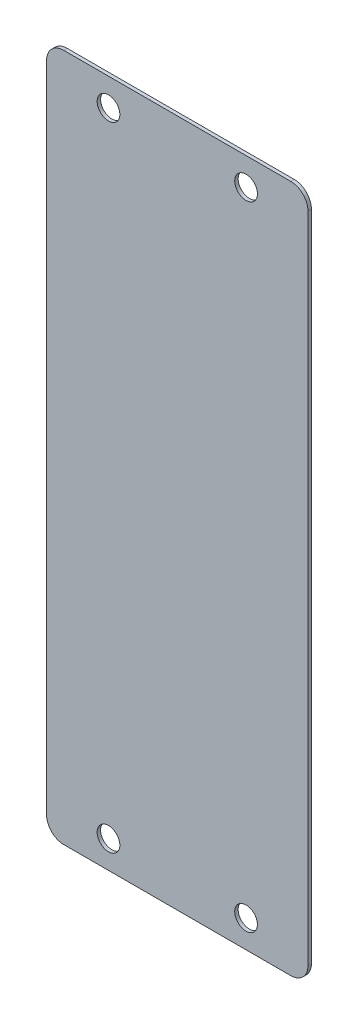
ISO-10303-21;
HEADER;
FILE_DESCRIPTION(('STEP AP214'),'2;1');
FILE_NAME('part.step','',(''),(''),'','','');
FILE_SCHEMA(('AUTOMOTIVE_DESIGN { 1 0 10303 214 1 1 1 1 }'));
ENDSEC;
DATA;
#1=APPLICATION_CONTEXT('core data for automotive mechanical design processes');
#2=APPLICATION_PROTOCOL_DEFINITION('international standard','automotive_design',2000,#1);
#3=PRODUCT_CONTEXT('',#1,'mechanical');
#4=PRODUCT('Part','Part','',(#3));
#5=PRODUCT_RELATED_PRODUCT_CATEGORY('part','',(#4));
#6=PRODUCT_DEFINITION_FORMATION('','',#4);
#7=PRODUCT_DEFINITION_CONTEXT('part definition',#1,'design');
#8=PRODUCT_DEFINITION('design','',#6,#7);
#9=PRODUCT_DEFINITION_SHAPE('','',#8);
#10=(LENGTH_UNIT() NAMED_UNIT(*) SI_UNIT(.MILLI.,.METRE.));
#11=(NAMED_UNIT(*) PLANE_ANGLE_UNIT() SI_UNIT($,.RADIAN.));
#12=(NAMED_UNIT(*) SI_UNIT($,.STERADIAN.) SOLID_ANGLE_UNIT());
#13=UNCERTAINTY_MEASURE_WITH_UNIT(LENGTH_MEASURE(1.E-05),#10,'distance_accuracy_value','');
#14=(GEOMETRIC_REPRESENTATION_CONTEXT(3) GLOBAL_UNCERTAINTY_ASSIGNED_CONTEXT((#13)) GLOBAL_UNIT_ASSIGNED_CONTEXT((#10,
#11,#12)) REPRESENTATION_CONTEXT('',''));
#15=CARTESIAN_POINT('',(0.,0.,0.));
#16=DIRECTION('',(0.,0.,1.));
#17=DIRECTION('',(1.,0.,0.));
#18=AXIS2_PLACEMENT_3D('',#15,#16,#17);
#19=CARTESIAN_POINT('',(38.,100.,1.));
#20=DIRECTION('',(-1.,0.,0.));
#21=DIRECTION('',(0.,-1.,0.));
#22=AXIS2_PLACEMENT_3D('',#19,#20,#21);
#23=PLANE('',#22);
#24=DIRECTION('',(0.,1.,0.));
#25=VECTOR('',#24,1.);
#26=CARTESIAN_POINT('',(38.,100.,1.));
#27=LINE('',#26,#25);
#28=CARTESIAN_POINT('',(38.,-95.,1.));
#29=VERTEX_POINT('',#28);
#30=CARTESIAN_POINT('',(38.,95.,1.));
#31=VERTEX_POINT('',#30);
#32=EDGE_CURVE('E133',#29,#31,#27,.T.);
#33=ORIENTED_EDGE('',*,*,#32,.F.);
#34=DIRECTION('',(0.,0.,-1.));
#35=VECTOR('',#34,1.);
#36=CARTESIAN_POINT('',(38.,-95.,1.));
#37=LINE('',#36,#35);
#38=CARTESIAN_POINT('',(38.,-95.,0.));
#39=VERTEX_POINT('',#38);
#40=EDGE_CURVE('E173',#29,#39,#37,.T.);
#41=ORIENTED_EDGE('',*,*,#40,.T.);
#42=DIRECTION('',(0.,1.,0.));
#43=VECTOR('',#42,1.);
#44=CARTESIAN_POINT('',(38.,100.,0.));
#45=LINE('',#44,#43);
#46=CARTESIAN_POINT('',(38.,95.,0.));
#47=VERTEX_POINT('',#46);
#48=EDGE_CURVE('E185',#39,#47,#45,.T.);
#49=ORIENTED_EDGE('',*,*,#48,.T.);
#50=DIRECTION('',(0.,0.,-1.));
#51=VECTOR('',#50,1.);
#52=CARTESIAN_POINT('',(38.,95.,1.));
#53=LINE('',#52,#51);
#54=EDGE_CURVE('E170',#47,#31,#53,.F.);
#55=ORIENTED_EDGE('',*,*,#54,.T.);
#56=EDGE_LOOP('',(#33,#41,#49,#55));
#57=FACE_BOUND('',#56,.T.);
#58=ADVANCED_FACE('F38',(#57),#23,.F.);
#59=CARTESIAN_POINT('',(-38.,100.,1.));
#60=DIRECTION('',(0.,-1.,0.));
#61=DIRECTION('',(0.,0.,-1.));
#62=AXIS2_PLACEMENT_3D('',#59,#60,#61);
#63=PLANE('',#62);
#64=DIRECTION('',(-1.,0.,0.));
#65=VECTOR('',#64,1.);
#66=CARTESIAN_POINT('',(-38.,100.,0.));
#67=LINE('',#66,#65);
#68=CARTESIAN_POINT('',(33.,100.,0.));
#69=VERTEX_POINT('',#68);
#70=CARTESIAN_POINT('',(-33.,100.,0.));
#71=VERTEX_POINT('',#70);
#72=EDGE_CURVE('E141',#69,#71,#67,.T.);
#73=ORIENTED_EDGE('',*,*,#72,.T.);
#74=DIRECTION('',(0.,0.,-1.));
#75=VECTOR('',#74,1.);
#76=CARTESIAN_POINT('',(-33.,100.,1.));
#77=LINE('',#76,#75);
#78=CARTESIAN_POINT('',(-33.,100.,1.));
#79=VERTEX_POINT('',#78);
#80=EDGE_CURVE('E11',#71,#79,#77,.F.);
#81=ORIENTED_EDGE('',*,*,#80,.T.);
#82=DIRECTION('',(-1.,0.,0.));
#83=VECTOR('',#82,1.);
#84=CARTESIAN_POINT('',(-38.,100.,1.));
#85=LINE('',#84,#83);
#86=CARTESIAN_POINT('',(33.,100.,1.));
#87=VERTEX_POINT('',#86);
#88=EDGE_CURVE('E139',#87,#79,#85,.T.);
#89=ORIENTED_EDGE('',*,*,#88,.F.);
#90=DIRECTION('',(0.,0.,-1.));
#91=VECTOR('',#90,1.);
#92=CARTESIAN_POINT('',(33.,100.,1.));
#93=LINE('',#92,#91);
#94=EDGE_CURVE('E47',#87,#69,#93,.T.);
#95=ORIENTED_EDGE('',*,*,#94,.T.);
#96=EDGE_LOOP('',(#73,#81,#89,#95));
#97=FACE_BOUND('',#96,.T.);
#98=ADVANCED_FACE('F181',(#97),#63,.F.);
#99=CARTESIAN_POINT('',(-38.,100.,1.));
#100=DIRECTION('',(1.,0.,0.));
#101=DIRECTION('',(0.,1.,0.));
#102=AXIS2_PLACEMENT_3D('',#99,#100,#101);
#103=PLANE('',#102);
#104=DIRECTION('',(0.,-1.,0.));
#105=VECTOR('',#104,1.);
#106=CARTESIAN_POINT('',(-38.,100.,0.));
#107=LINE('',#106,#105);
#108=CARTESIAN_POINT('',(-38.,95.,0.));
#109=VERTEX_POINT('',#108);
#110=CARTESIAN_POINT('',(-38.,-95.,0.));
#111=VERTEX_POINT('',#110);
#112=EDGE_CURVE('E134',#109,#111,#107,.T.);
#113=ORIENTED_EDGE('',*,*,#112,.T.);
#114=DIRECTION('',(0.,0.,-1.));
#115=VECTOR('',#114,1.);
#116=CARTESIAN_POINT('',(-38.,-95.,1.));
#117=LINE('',#116,#115);
#118=CARTESIAN_POINT('',(-38.,-95.,1.));
#119=VERTEX_POINT('',#118);
#120=EDGE_CURVE('E109',#111,#119,#117,.F.);
#121=ORIENTED_EDGE('',*,*,#120,.T.);
#122=DIRECTION('',(0.,-1.,0.));
#123=VECTOR('',#122,1.);
#124=CARTESIAN_POINT('',(-38.,100.,1.));
#125=LINE('',#124,#123);
#126=CARTESIAN_POINT('',(-38.,95.,1.));
#127=VERTEX_POINT('',#126);
#128=EDGE_CURVE('E193',#127,#119,#125,.T.);
#129=ORIENTED_EDGE('',*,*,#128,.F.);
#130=DIRECTION('',(0.,0.,-1.));
#131=VECTOR('',#130,1.);
#132=CARTESIAN_POINT('',(-38.,95.,1.));
#133=LINE('',#132,#131);
#134=EDGE_CURVE('E115',#127,#109,#133,.T.);
#135=ORIENTED_EDGE('',*,*,#134,.T.);
#136=EDGE_LOOP('',(#113,#121,#129,#135));
#137=FACE_BOUND('',#136,.T.);
#138=ADVANCED_FACE('F252',(#137),#103,.F.);
#139=CARTESIAN_POINT('',(-38.,-100.,1.));
#140=DIRECTION('',(0.,1.,0.));
#141=DIRECTION('',(0.,0.,1.));
#142=AXIS2_PLACEMENT_3D('',#139,#140,#141);
#143=PLANE('',#142);
#144=DIRECTION('',(1.,0.,0.));
#145=VECTOR('',#144,1.);
#146=CARTESIAN_POINT('',(-38.,-100.,1.));
#147=LINE('',#146,#145);
#148=CARTESIAN_POINT('',(-33.,-100.,1.));
#149=VERTEX_POINT('',#148);
#150=CARTESIAN_POINT('',(33.,-100.,1.));
#151=VERTEX_POINT('',#150);
#152=EDGE_CURVE('E125',#149,#151,#147,.T.);
#153=ORIENTED_EDGE('',*,*,#152,.F.);
#154=DIRECTION('',(0.,0.,-1.));
#155=VECTOR('',#154,1.);
#156=CARTESIAN_POINT('',(-33.,-100.,1.));
#157=LINE('',#156,#155);
#158=CARTESIAN_POINT('',(-33.,-100.,0.));
#159=VERTEX_POINT('',#158);
#160=EDGE_CURVE('E108',#149,#159,#157,.T.);
#161=ORIENTED_EDGE('',*,*,#160,.T.);
#162=DIRECTION('',(1.,0.,0.));
#163=VECTOR('',#162,1.);
#164=CARTESIAN_POINT('',(-38.,-100.,0.));
#165=LINE('',#164,#163);
#166=CARTESIAN_POINT('',(33.,-100.,0.));
#167=VERTEX_POINT('',#166);
#168=EDGE_CURVE('E122',#159,#167,#165,.T.);
#169=ORIENTED_EDGE('',*,*,#168,.T.);
#170=DIRECTION('',(0.,0.,-1.));
#171=VECTOR('',#170,1.);
#172=CARTESIAN_POINT('',(33.,-100.,1.));
#173=LINE('',#172,#171);
#174=EDGE_CURVE('E128',#167,#151,#173,.F.);
#175=ORIENTED_EDGE('',*,*,#174,.T.);
#176=EDGE_LOOP('',(#153,#161,#169,#175));
#177=FACE_BOUND('',#176,.T.);
#178=ADVANCED_FACE('F121',(#177),#143,.F.);
#179=CARTESIAN_POINT('',(0.,0.,1.));
#180=DIRECTION('',(0.,0.,1.));
#181=DIRECTION('',(1.,0.,0.));
#182=AXIS2_PLACEMENT_3D('',#179,#180,#181);
#183=PLANE('',#182);
#184=CARTESIAN_POINT('',(20.,92.,1.));
#185=DIRECTION('',(0.,0.,1.));
#186=DIRECTION('',(1.,0.,0.));
#187=AXIS2_PLACEMENT_3D('',#184,#185,#186);
#188=CIRCLE('',#187,3.3);
#189=CARTESIAN_POINT('',(23.3,92.,1.));
#190=VERTEX_POINT('',#189);
#191=EDGE_CURVE('E216',#190,#190,#188,.T.);
#192=ORIENTED_EDGE('',*,*,#191,.F.);
#193=EDGE_LOOP('',(#192));
#194=FACE_BOUND('',#193,.T.);
#195=CARTESIAN_POINT('',(-20.,-92.,1.));
#196=DIRECTION('',(0.,0.,1.));
#197=DIRECTION('',(1.,0.,0.));
#198=AXIS2_PLACEMENT_3D('',#195,#196,#197);
#199=CIRCLE('',#198,3.3);
#200=CARTESIAN_POINT('',(-16.7,-92.,1.));
#201=VERTEX_POINT('',#200);
#202=EDGE_CURVE('E207',#201,#201,#199,.T.);
#203=ORIENTED_EDGE('',*,*,#202,.F.);
#204=EDGE_LOOP('',(#203));
#205=FACE_BOUND('',#204,.T.);
#206=CARTESIAN_POINT('',(20.,-92.,1.));
#207=DIRECTION('',(0.,0.,1.));
#208=DIRECTION('',(1.,0.,0.));
#209=AXIS2_PLACEMENT_3D('',#206,#207,#208);
#210=CIRCLE('',#209,3.3);
#211=CARTESIAN_POINT('',(23.3,-92.,1.));
#212=VERTEX_POINT('',#211);
#213=EDGE_CURVE('E223',#212,#212,#210,.T.);
#214=ORIENTED_EDGE('',*,*,#213,.F.);
#215=EDGE_LOOP('',(#214));
#216=FACE_BOUND('',#215,.T.);
#217=CARTESIAN_POINT('',(-20.,92.,1.));
#218=DIRECTION('',(0.,0.,1.));
#219=DIRECTION('',(1.,0.,0.));
#220=AXIS2_PLACEMENT_3D('',#217,#218,#219);
#221=CIRCLE('',#220,3.3);
#222=CARTESIAN_POINT('',(-16.7,92.,1.));
#223=VERTEX_POINT('',#222);
#224=EDGE_CURVE('E199',#223,#223,#221,.T.);
#225=ORIENTED_EDGE('',*,*,#224,.F.);
#226=EDGE_LOOP('',(#225));
#227=FACE_BOUND('',#226,.T.);
#228=ORIENTED_EDGE('',*,*,#128,.T.);
#229=CARTESIAN_POINT('',(-33.,-95.,1.));
#230=DIRECTION('',(0.,0.,1.));
#231=DIRECTION('',(1.,0.,0.));
#232=AXIS2_PLACEMENT_3D('',#229,#230,#231);
#233=CIRCLE('',#232,5.);
#234=EDGE_CURVE('E167',#119,#149,#233,.T.);
#235=ORIENTED_EDGE('',*,*,#234,.T.);
#236=ORIENTED_EDGE('',*,*,#152,.T.);
#237=CARTESIAN_POINT('',(33.,-95.,1.));
#238=DIRECTION('',(0.,0.,1.));
#239=DIRECTION('',(1.,0.,0.));
#240=AXIS2_PLACEMENT_3D('',#237,#238,#239);
#241=CIRCLE('',#240,5.);
#242=EDGE_CURVE('E164',#151,#29,#241,.T.);
#243=ORIENTED_EDGE('',*,*,#242,.T.);
#244=ORIENTED_EDGE('',*,*,#32,.T.);
#245=CARTESIAN_POINT('',(33.,95.,1.));
#246=DIRECTION('',(0.,0.,1.));
#247=DIRECTION('',(1.,0.,0.));
#248=AXIS2_PLACEMENT_3D('',#245,#246,#247);
#249=CIRCLE('',#248,5.);
#250=EDGE_CURVE('E59',#31,#87,#249,.T.);
#251=ORIENTED_EDGE('',*,*,#250,.T.);
#252=ORIENTED_EDGE('',*,*,#88,.T.);
#253=CARTESIAN_POINT('',(-33.,95.,1.));
#254=DIRECTION('',(0.,0.,1.));
#255=DIRECTION('',(1.,0.,0.));
#256=AXIS2_PLACEMENT_3D('',#253,#254,#255);
#257=CIRCLE('',#256,5.);
#258=EDGE_CURVE('E161',#79,#127,#257,.T.);
#259=ORIENTED_EDGE('',*,*,#258,.T.);
#260=EDGE_LOOP('',(#228,#235,#236,#243,#244,#251,#252,#259));
#261=FACE_BOUND('',#260,.T.);
#262=ADVANCED_FACE('F242',(#194,#205,#216,#227,#261),#183,.T.);
#263=CARTESIAN_POINT('',(0.,0.,0.));
#264=DIRECTION('',(0.,0.,1.));
#265=DIRECTION('',(1.,0.,0.));
#266=AXIS2_PLACEMENT_3D('',#263,#264,#265);
#267=PLANE('',#266);
#268=CARTESIAN_POINT('',(20.,92.,0.));
#269=DIRECTION('',(0.,0.,1.));
#270=DIRECTION('',(1.,0.,0.));
#271=AXIS2_PLACEMENT_3D('',#268,#269,#270);
#272=CIRCLE('',#271,3.3);
#273=CARTESIAN_POINT('',(23.3,92.,0.));
#274=VERTEX_POINT('',#273);
#275=EDGE_CURVE('E203',#274,#274,#272,.T.);
#276=ORIENTED_EDGE('',*,*,#275,.T.);
#277=EDGE_LOOP('',(#276));
#278=FACE_BOUND('',#277,.T.);
#279=CARTESIAN_POINT('',(-20.,-92.,0.));
#280=DIRECTION('',(0.,0.,1.));
#281=DIRECTION('',(1.,0.,0.));
#282=AXIS2_PLACEMENT_3D('',#279,#280,#281);
#283=CIRCLE('',#282,3.3);
#284=CARTESIAN_POINT('',(-16.7,-92.,0.));
#285=VERTEX_POINT('',#284);
#286=EDGE_CURVE('E211',#285,#285,#283,.T.);
#287=ORIENTED_EDGE('',*,*,#286,.T.);
#288=EDGE_LOOP('',(#287));
#289=FACE_BOUND('',#288,.T.);
#290=CARTESIAN_POINT('',(20.,-92.,0.));
#291=DIRECTION('',(0.,0.,1.));
#292=DIRECTION('',(1.,0.,0.));
#293=AXIS2_PLACEMENT_3D('',#290,#291,#292);
#294=CIRCLE('',#293,3.3);
#295=CARTESIAN_POINT('',(23.3,-92.,0.));
#296=VERTEX_POINT('',#295);
#297=EDGE_CURVE('E212',#296,#296,#294,.T.);
#298=ORIENTED_EDGE('',*,*,#297,.T.);
#299=EDGE_LOOP('',(#298));
#300=FACE_BOUND('',#299,.T.);
#301=CARTESIAN_POINT('',(-20.,92.,0.));
#302=DIRECTION('',(0.,0.,1.));
#303=DIRECTION('',(1.,0.,0.));
#304=AXIS2_PLACEMENT_3D('',#301,#302,#303);
#305=CIRCLE('',#304,3.3);
#306=CARTESIAN_POINT('',(-16.7,92.,0.));
#307=VERTEX_POINT('',#306);
#308=EDGE_CURVE('E188',#307,#307,#305,.T.);
#309=ORIENTED_EDGE('',*,*,#308,.T.);
#310=EDGE_LOOP('',(#309));
#311=FACE_BOUND('',#310,.T.);
#312=ORIENTED_EDGE('',*,*,#168,.F.);
#313=CARTESIAN_POINT('',(-33.,-95.,0.));
#314=DIRECTION('',(0.,0.,1.));
#315=DIRECTION('',(1.,0.,0.));
#316=AXIS2_PLACEMENT_3D('',#313,#314,#315);
#317=CIRCLE('',#316,5.);
#318=EDGE_CURVE('E104',#159,#111,#317,.F.);
#319=ORIENTED_EDGE('',*,*,#318,.T.);
#320=ORIENTED_EDGE('',*,*,#112,.F.);
#321=CARTESIAN_POINT('',(-33.,95.,0.));
#322=DIRECTION('',(0.,0.,1.));
#323=DIRECTION('',(1.,0.,0.));
#324=AXIS2_PLACEMENT_3D('',#321,#322,#323);
#325=CIRCLE('',#324,5.);
#326=EDGE_CURVE('E149',#109,#71,#325,.F.);
#327=ORIENTED_EDGE('',*,*,#326,.T.);
#328=ORIENTED_EDGE('',*,*,#72,.F.);
#329=CARTESIAN_POINT('',(33.,95.,0.));
#330=DIRECTION('',(0.,0.,1.));
#331=DIRECTION('',(1.,0.,0.));
#332=AXIS2_PLACEMENT_3D('',#329,#330,#331);
#333=CIRCLE('',#332,5.);
#334=EDGE_CURVE('E127',#69,#47,#333,.F.);
#335=ORIENTED_EDGE('',*,*,#334,.T.);
#336=ORIENTED_EDGE('',*,*,#48,.F.);
#337=CARTESIAN_POINT('',(33.,-95.,0.));
#338=DIRECTION('',(0.,0.,1.));
#339=DIRECTION('',(1.,0.,0.));
#340=AXIS2_PLACEMENT_3D('',#337,#338,#339);
#341=CIRCLE('',#340,5.);
#342=EDGE_CURVE('E116',#39,#167,#341,.F.);
#343=ORIENTED_EDGE('',*,*,#342,.T.);
#344=EDGE_LOOP('',(#312,#319,#320,#327,#328,#335,#336,#343));
#345=FACE_BOUND('',#344,.T.);
#346=ADVANCED_FACE('F130',(#278,#289,#300,#311,#345),#267,.F.);
#347=CARTESIAN_POINT('',(-20.,92.,0.));
#348=DIRECTION('',(0.,0.,1.));
#349=DIRECTION('',(1.,0.,0.));
#350=AXIS2_PLACEMENT_3D('',#347,#348,#349);
#351=CYLINDRICAL_SURFACE('',#350,3.3);
#352=ORIENTED_EDGE('',*,*,#308,.F.);
#353=EDGE_LOOP('',(#352));
#354=FACE_BOUND('',#353,.T.);
#355=ORIENTED_EDGE('',*,*,#224,.T.);
#356=EDGE_LOOP('',(#355));
#357=FACE_BOUND('',#356,.T.);
#358=ADVANCED_FACE('F238',(#354,#357),#351,.F.);
#359=CARTESIAN_POINT('',(20.,-92.,0.));
#360=DIRECTION('',(0.,0.,1.));
#361=DIRECTION('',(1.,0.,0.));
#362=AXIS2_PLACEMENT_3D('',#359,#360,#361);
#363=CYLINDRICAL_SURFACE('',#362,3.3);
#364=ORIENTED_EDGE('',*,*,#297,.F.);
#365=EDGE_LOOP('',(#364));
#366=FACE_BOUND('',#365,.T.);
#367=ORIENTED_EDGE('',*,*,#213,.T.);
#368=EDGE_LOOP('',(#367));
#369=FACE_BOUND('',#368,.T.);
#370=ADVANCED_FACE('F234',(#366,#369),#363,.F.);
#371=CARTESIAN_POINT('',(-20.,-92.,0.));
#372=DIRECTION('',(0.,0.,1.));
#373=DIRECTION('',(1.,0.,0.));
#374=AXIS2_PLACEMENT_3D('',#371,#372,#373);
#375=CYLINDRICAL_SURFACE('',#374,3.3);
#376=ORIENTED_EDGE('',*,*,#286,.F.);
#377=EDGE_LOOP('',(#376));
#378=FACE_BOUND('',#377,.T.);
#379=ORIENTED_EDGE('',*,*,#202,.T.);
#380=EDGE_LOOP('',(#379));
#381=FACE_BOUND('',#380,.T.);
#382=ADVANCED_FACE('F237',(#378,#381),#375,.F.);
#383=CARTESIAN_POINT('',(20.,92.,0.));
#384=DIRECTION('',(0.,0.,1.));
#385=DIRECTION('',(1.,0.,0.));
#386=AXIS2_PLACEMENT_3D('',#383,#384,#385);
#387=CYLINDRICAL_SURFACE('',#386,3.3);
#388=ORIENTED_EDGE('',*,*,#275,.F.);
#389=EDGE_LOOP('',(#388));
#390=FACE_BOUND('',#389,.T.);
#391=ORIENTED_EDGE('',*,*,#191,.T.);
#392=EDGE_LOOP('',(#391));
#393=FACE_BOUND('',#392,.T.);
#394=ADVANCED_FACE('F274',(#390,#393),#387,.F.);
#395=CARTESIAN_POINT('',(-33.,-95.,1.));
#396=DIRECTION('',(0.,0.,-1.));
#397=DIRECTION('',(-1.,0.,0.));
#398=AXIS2_PLACEMENT_3D('',#395,#396,#397);
#399=CYLINDRICAL_SURFACE('',#398,5.);
#400=ORIENTED_EDGE('',*,*,#234,.F.);
#401=ORIENTED_EDGE('',*,*,#120,.F.);
#402=ORIENTED_EDGE('',*,*,#318,.F.);
#403=ORIENTED_EDGE('',*,*,#160,.F.);
#404=EDGE_LOOP('',(#400,#401,#402,#403));
#405=FACE_BOUND('',#404,.T.);
#406=ADVANCED_FACE('F107',(#405),#399,.T.);
#407=CARTESIAN_POINT('',(33.,-95.,1.));
#408=DIRECTION('',(0.,0.,-1.));
#409=DIRECTION('',(-1.,0.,0.));
#410=AXIS2_PLACEMENT_3D('',#407,#408,#409);
#411=CYLINDRICAL_SURFACE('',#410,5.);
#412=ORIENTED_EDGE('',*,*,#242,.F.);
#413=ORIENTED_EDGE('',*,*,#174,.F.);
#414=ORIENTED_EDGE('',*,*,#342,.F.);
#415=ORIENTED_EDGE('',*,*,#40,.F.);
#416=EDGE_LOOP('',(#412,#413,#414,#415));
#417=FACE_BOUND('',#416,.T.);
#418=ADVANCED_FACE('F256',(#417),#411,.T.);
#419=CARTESIAN_POINT('',(-33.,95.,1.));
#420=DIRECTION('',(0.,0.,-1.));
#421=DIRECTION('',(-1.,0.,0.));
#422=AXIS2_PLACEMENT_3D('',#419,#420,#421);
#423=CYLINDRICAL_SURFACE('',#422,5.);
#424=ORIENTED_EDGE('',*,*,#258,.F.);
#425=ORIENTED_EDGE('',*,*,#80,.F.);
#426=ORIENTED_EDGE('',*,*,#326,.F.);
#427=ORIENTED_EDGE('',*,*,#134,.F.);
#428=EDGE_LOOP('',(#424,#425,#426,#427));
#429=FACE_BOUND('',#428,.T.);
#430=ADVANCED_FACE('F254',(#429),#423,.T.);
#431=CARTESIAN_POINT('',(33.,95.,1.));
#432=DIRECTION('',(0.,0.,-1.));
#433=DIRECTION('',(-1.,0.,0.));
#434=AXIS2_PLACEMENT_3D('',#431,#432,#433);
#435=CYLINDRICAL_SURFACE('',#434,5.);
#436=ORIENTED_EDGE('',*,*,#250,.F.);
#437=ORIENTED_EDGE('',*,*,#54,.F.);
#438=ORIENTED_EDGE('',*,*,#334,.F.);
#439=ORIENTED_EDGE('',*,*,#94,.F.);
#440=EDGE_LOOP('',(#436,#437,#438,#439));
#441=FACE_BOUND('',#440,.T.);
#442=ADVANCED_FACE('F40',(#441),#435,.T.);
#443=CLOSED_SHELL('',(#58,#98,#138,#178,#262,#346,#358,#370,#382,#394,#406,#418,#430,#442));
#444=MANIFOLD_SOLID_BREP('B2',#443);
#445=ADVANCED_BREP_SHAPE_REPRESENTATION('',(#18,#444),#14);
#446=SHAPE_DEFINITION_REPRESENTATION(#9,#445);
ENDSEC;
END-ISO-10303-21;
